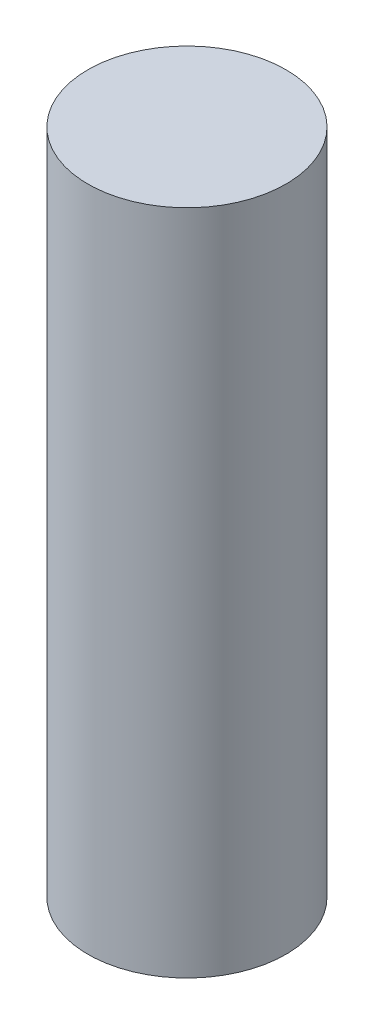
ISO-10303-21;
HEADER;
FILE_DESCRIPTION(('STEP AP214'),'2;1');
FILE_NAME('part.step','',(''),(''),'','','');
FILE_SCHEMA(('AUTOMOTIVE_DESIGN { 1 0 10303 214 1 1 1 1 }'));
ENDSEC;
DATA;
#1=APPLICATION_CONTEXT('core data for automotive mechanical design processes');
#2=APPLICATION_PROTOCOL_DEFINITION('international standard','automotive_design',2000,#1);
#3=PRODUCT_CONTEXT('',#1,'mechanical');
#4=PRODUCT('Part','Part','',(#3));
#5=PRODUCT_RELATED_PRODUCT_CATEGORY('part','',(#4));
#6=PRODUCT_DEFINITION_FORMATION('','',#4);
#7=PRODUCT_DEFINITION_CONTEXT('part definition',#1,'design');
#8=PRODUCT_DEFINITION('design','',#6,#7);
#9=PRODUCT_DEFINITION_SHAPE('','',#8);
#10=(LENGTH_UNIT() NAMED_UNIT(*) SI_UNIT(.MILLI.,.METRE.));
#11=(NAMED_UNIT(*) PLANE_ANGLE_UNIT() SI_UNIT($,.RADIAN.));
#12=(NAMED_UNIT(*) SI_UNIT($,.STERADIAN.) SOLID_ANGLE_UNIT());
#13=UNCERTAINTY_MEASURE_WITH_UNIT(LENGTH_MEASURE(1.E-05),#10,'distance_accuracy_value','');
#14=(GEOMETRIC_REPRESENTATION_CONTEXT(3) GLOBAL_UNCERTAINTY_ASSIGNED_CONTEXT((#13)) GLOBAL_UNIT_ASSIGNED_CONTEXT((#10,
#11,#12)) REPRESENTATION_CONTEXT('',''));
#15=CARTESIAN_POINT('',(0.,0.,0.));
#16=DIRECTION('',(0.,0.,1.));
#17=DIRECTION('',(1.,0.,0.));
#18=AXIS2_PLACEMENT_3D('',#15,#16,#17);
#19=CARTESIAN_POINT('',(0.75,0.,0.));
#20=DIRECTION('',(0.,-1.,0.));
#21=DIRECTION('',(0.,0.,-1.));
#22=AXIS2_PLACEMENT_3D('',#19,#20,#21);
#23=PLANE('',#22);
#24=CARTESIAN_POINT('',(0.,0.,0.));
#25=DIRECTION('',(0.,-1.,0.));
#26=DIRECTION('',(0.,0.,-1.));
#27=AXIS2_PLACEMENT_3D('',#24,#25,#26);
#28=CIRCLE('',#27,1.5);
#29=CARTESIAN_POINT('',(0.,0.,-1.5));
#30=VERTEX_POINT('',#29);
#31=EDGE_CURVE('E18',#30,#30,#28,.F.);
#32=ORIENTED_EDGE('',*,*,#31,.F.);
#33=EDGE_LOOP('',(#32));
#34=FACE_BOUND('',#33,.T.);
#35=ADVANCED_FACE('F15',(#34),#23,.T.);
#36=CARTESIAN_POINT('',(0.,3.00000000000001,0.));
#37=DIRECTION('',(0.,-1.,0.));
#38=DIRECTION('',(0.,0.,-1.));
#39=AXIS2_PLACEMENT_3D('',#36,#37,#38);
#40=CYLINDRICAL_SURFACE('',#39,1.5);
#41=CARTESIAN_POINT('',(0.,6.,0.));
#42=DIRECTION('',(0.,-1.,0.));
#43=DIRECTION('',(0.,0.,-1.));
#44=AXIS2_PLACEMENT_3D('',#41,#42,#43);
#45=CIRCLE('',#44,1.5);
#46=CARTESIAN_POINT('',(0.,6.,-1.5));
#47=VERTEX_POINT('',#46);
#48=EDGE_CURVE('E27',#47,#47,#45,.F.);
#49=ORIENTED_EDGE('',*,*,#48,.F.);
#50=EDGE_LOOP('',(#49));
#51=FACE_BOUND('',#50,.T.);
#52=ORIENTED_EDGE('',*,*,#31,.T.);
#53=EDGE_LOOP('',(#52));
#54=FACE_BOUND('',#53,.T.);
#55=ADVANCED_FACE('F35',(#51,#54),#40,.T.);
#56=CARTESIAN_POINT('',(6.9875,6.,0.));
#57=DIRECTION('',(0.,-1.,0.));
#58=DIRECTION('',(0.,0.,-1.));
#59=AXIS2_PLACEMENT_3D('',#56,#57,#58);
#60=PLANE('',#59);
#61=ORIENTED_EDGE('',*,*,#48,.T.);
#62=EDGE_LOOP('',(#61));
#63=FACE_BOUND('',#62,.T.);
#64=CARTESIAN_POINT('',(0.,6.00000000000001,0.));
#65=DIRECTION('',(0.,-1.,0.));
#66=DIRECTION('',(0.,0.,-1.));
#67=AXIS2_PLACEMENT_3D('',#64,#65,#66);
#68=CIRCLE('',#67,12.475);
#69=CARTESIAN_POINT('',(0.,6.00000000000001,-12.475));
#70=VERTEX_POINT('',#69);
#71=EDGE_CURVE('E22',#70,#70,#68,.F.);
#72=ORIENTED_EDGE('',*,*,#71,.F.);
#73=EDGE_LOOP('',(#72));
#74=FACE_BOUND('',#73,.T.);
#75=ADVANCED_FACE('F42',(#63,#74),#60,.T.);
#76=CARTESIAN_POINT('',(6.2375,90.,0.));
#77=DIRECTION('',(0.,1.,0.));
#78=DIRECTION('',(0.,0.,1.));
#79=AXIS2_PLACEMENT_3D('',#76,#77,#78);
#80=PLANE('',#79);
#81=CARTESIAN_POINT('',(0.,90.,0.));
#82=DIRECTION('',(0.,-1.,0.));
#83=DIRECTION('',(0.,0.,-1.));
#84=AXIS2_PLACEMENT_3D('',#81,#82,#83);
#85=CIRCLE('',#84,12.475);
#86=CARTESIAN_POINT('',(0.,90.,-12.475));
#87=VERTEX_POINT('',#86);
#88=EDGE_CURVE('E10',#87,#87,#85,.T.);
#89=ORIENTED_EDGE('',*,*,#88,.F.);
#90=EDGE_LOOP('',(#89));
#91=FACE_BOUND('',#90,.T.);
#92=ADVANCED_FACE('F46',(#91),#80,.T.);
#93=CARTESIAN_POINT('',(0.,48.,0.));
#94=DIRECTION('',(0.,-1.,0.));
#95=DIRECTION('',(0.,0.,-1.));
#96=AXIS2_PLACEMENT_3D('',#93,#94,#95);
#97=CYLINDRICAL_SURFACE('',#96,12.475);
#98=ORIENTED_EDGE('',*,*,#88,.T.);
#99=EDGE_LOOP('',(#98));
#100=FACE_BOUND('',#99,.T.);
#101=ORIENTED_EDGE('',*,*,#71,.T.);
#102=EDGE_LOOP('',(#101));
#103=FACE_BOUND('',#102,.T.);
#104=ADVANCED_FACE('F44',(#100,#103),#97,.T.);
#105=CLOSED_SHELL('',(#35,#55,#75,#92,#104));
#106=MANIFOLD_SOLID_BREP('B1',#105);
#107=ADVANCED_BREP_SHAPE_REPRESENTATION('',(#18,#106),#14);
#108=SHAPE_DEFINITION_REPRESENTATION(#9,#107);
ENDSEC;
END-ISO-10303-21;
